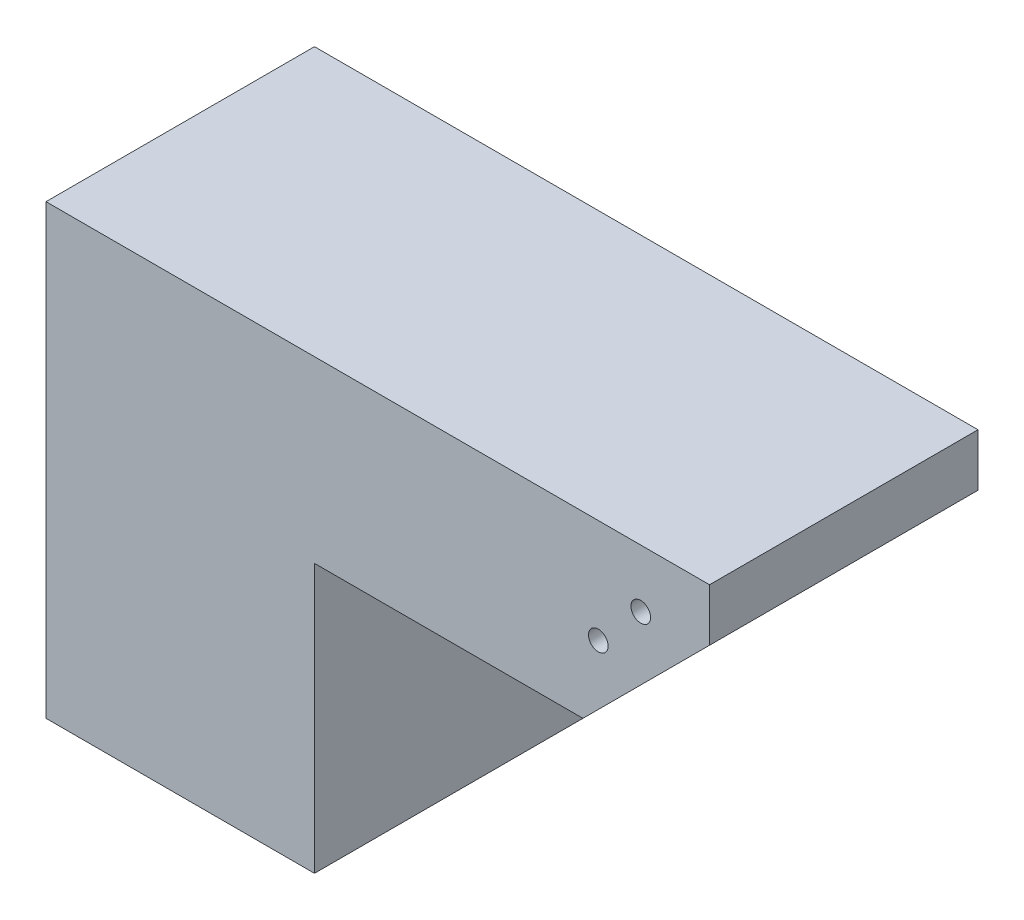
ISO-10303-21;
HEADER;
FILE_DESCRIPTION(('STEP AP214'),'2;1');
FILE_NAME('part.step','',(''),(''),'','','');
FILE_SCHEMA(('AUTOMOTIVE_DESIGN { 1 0 10303 214 1 1 1 1 }'));
ENDSEC;
DATA;
#1=APPLICATION_CONTEXT('core data for automotive mechanical design processes');
#2=APPLICATION_PROTOCOL_DEFINITION('international standard','automotive_design',2000,#1);
#3=PRODUCT_CONTEXT('',#1,'mechanical');
#4=PRODUCT('Part','Part','',(#3));
#5=PRODUCT_RELATED_PRODUCT_CATEGORY('part','',(#4));
#6=PRODUCT_DEFINITION_FORMATION('','',#4);
#7=PRODUCT_DEFINITION_CONTEXT('part definition',#1,'design');
#8=PRODUCT_DEFINITION('design','',#6,#7);
#9=PRODUCT_DEFINITION_SHAPE('','',#8);
#10=(LENGTH_UNIT() NAMED_UNIT(*) SI_UNIT(.MILLI.,.METRE.));
#11=(NAMED_UNIT(*) PLANE_ANGLE_UNIT() SI_UNIT($,.RADIAN.));
#12=(NAMED_UNIT(*) SI_UNIT($,.STERADIAN.) SOLID_ANGLE_UNIT());
#13=UNCERTAINTY_MEASURE_WITH_UNIT(LENGTH_MEASURE(1.E-05),#10,'distance_accuracy_value','');
#14=(GEOMETRIC_REPRESENTATION_CONTEXT(3) GLOBAL_UNCERTAINTY_ASSIGNED_CONTEXT((#13)) GLOBAL_UNIT_ASSIGNED_CONTEXT((#10,
#11,#12)) REPRESENTATION_CONTEXT('',''));
#15=CARTESIAN_POINT('',(0.,0.,0.));
#16=DIRECTION('',(0.,0.,1.));
#17=DIRECTION('',(1.,0.,0.));
#18=AXIS2_PLACEMENT_3D('',#15,#16,#17);
#19=CARTESIAN_POINT('',(0.,0.,15.));
#20=DIRECTION('',(0.,1.,0.));
#21=DIRECTION('',(0.,0.,1.));
#22=AXIS2_PLACEMENT_3D('',#19,#20,#21);
#23=PLANE('',#22);
#24=DIRECTION('',(-1.,0.,0.));
#25=VECTOR('',#24,1.);
#26=CARTESIAN_POINT('',(-11.85,0.,11.85));
#27=LINE('',#26,#25);
#28=CARTESIAN_POINT('',(11.85,0.,11.85));
#29=VERTEX_POINT('',#28);
#30=CARTESIAN_POINT('',(-11.85,0.,11.85));
#31=VERTEX_POINT('',#30);
#32=EDGE_CURVE('E205',#29,#31,#27,.T.);
#33=ORIENTED_EDGE('',*,*,#32,.F.);
#34=DIRECTION('',(0.,0.,1.));
#35=VECTOR('',#34,1.);
#36=CARTESIAN_POINT('',(11.85,0.,11.85));
#37=LINE('',#36,#35);
#38=CARTESIAN_POINT('',(11.85,0.,-11.85));
#39=VERTEX_POINT('',#38);
#40=EDGE_CURVE('E65',#39,#29,#37,.T.);
#41=ORIENTED_EDGE('',*,*,#40,.F.);
#42=DIRECTION('',(1.,0.,0.));
#43=VECTOR('',#42,1.);
#44=CARTESIAN_POINT('',(-11.85,0.,-11.85));
#45=LINE('',#44,#43);
#46=CARTESIAN_POINT('',(-11.85,0.,-11.85));
#47=VERTEX_POINT('',#46);
#48=EDGE_CURVE('E194',#47,#39,#45,.T.);
#49=ORIENTED_EDGE('',*,*,#48,.F.);
#50=DIRECTION('',(0.,0.,-1.));
#51=VECTOR('',#50,1.);
#52=CARTESIAN_POINT('',(-11.85,0.,11.85));
#53=LINE('',#52,#51);
#54=EDGE_CURVE('E208',#31,#47,#53,.T.);
#55=ORIENTED_EDGE('',*,*,#54,.F.);
#56=EDGE_LOOP('',(#33,#41,#49,#55));
#57=FACE_BOUND('',#56,.T.);
#58=DIRECTION('',(1.,0.,0.));
#59=VECTOR('',#58,1.);
#60=CARTESIAN_POINT('',(0.,0.,-15.));
#61=LINE('',#60,#59);
#62=CARTESIAN_POINT('',(-15.,0.,-15.));
#63=VERTEX_POINT('',#62);
#64=CARTESIAN_POINT('',(15.,0.,-15.));
#65=VERTEX_POINT('',#64);
#66=EDGE_CURVE('E215',#63,#65,#61,.T.);
#67=ORIENTED_EDGE('',*,*,#66,.T.);
#68=DIRECTION('',(0.,0.,-1.));
#69=VECTOR('',#68,1.);
#70=CARTESIAN_POINT('',(15.,0.,15.));
#71=LINE('',#70,#69);
#72=CARTESIAN_POINT('',(15.,0.,15.));
#73=VERTEX_POINT('',#72);
#74=EDGE_CURVE('E11',#73,#65,#71,.T.);
#75=ORIENTED_EDGE('',*,*,#74,.F.);
#76=DIRECTION('',(1.,0.,0.));
#77=VECTOR('',#76,1.);
#78=CARTESIAN_POINT('',(-15.,0.,15.));
#79=LINE('',#78,#77);
#80=CARTESIAN_POINT('',(-15.,0.,15.));
#81=VERTEX_POINT('',#80);
#82=EDGE_CURVE('E221',#81,#73,#79,.T.);
#83=ORIENTED_EDGE('',*,*,#82,.F.);
#84=DIRECTION('',(0.,0.,-1.));
#85=VECTOR('',#84,1.);
#86=CARTESIAN_POINT('',(-15.,0.,15.));
#87=LINE('',#86,#85);
#88=EDGE_CURVE('E236',#81,#63,#87,.T.);
#89=ORIENTED_EDGE('',*,*,#88,.T.);
#90=EDGE_LOOP('',(#67,#75,#83,#89));
#91=FACE_BOUND('',#90,.T.);
#92=ADVANCED_FACE('F41',(#57,#91),#23,.F.);
#93=CARTESIAN_POINT('',(15.,0.,15.));
#94=DIRECTION('',(-1.,0.,0.));
#95=DIRECTION('',(0.,0.,1.));
#96=AXIS2_PLACEMENT_3D('',#93,#94,#95);
#97=PLANE('',#96);
#98=DIRECTION('',(0.,1.,0.));
#99=VECTOR('',#98,1.);
#100=CARTESIAN_POINT('',(15.,0.,-15.));
#101=LINE('',#100,#99);
#102=CARTESIAN_POINT('',(15.,30.,-15.));
#103=VERTEX_POINT('',#102);
#104=EDGE_CURVE('E238',#65,#103,#101,.T.);
#105=ORIENTED_EDGE('',*,*,#104,.T.);
#106=DIRECTION('',(0.,0.,-1.));
#107=VECTOR('',#106,1.);
#108=CARTESIAN_POINT('',(15.,30.,15.));
#109=LINE('',#108,#107);
#110=CARTESIAN_POINT('',(15.,30.,15.));
#111=VERTEX_POINT('',#110);
#112=EDGE_CURVE('E49',#111,#103,#109,.T.);
#113=ORIENTED_EDGE('',*,*,#112,.F.);
#114=DIRECTION('',(0.,1.,0.));
#115=VECTOR('',#114,1.);
#116=CARTESIAN_POINT('',(15.,0.,15.));
#117=LINE('',#116,#115);
#118=EDGE_CURVE('E223',#73,#111,#117,.T.);
#119=ORIENTED_EDGE('',*,*,#118,.F.);
#120=ORIENTED_EDGE('',*,*,#74,.T.);
#121=EDGE_LOOP('',(#105,#113,#119,#120));
#122=FACE_BOUND('',#121,.T.);
#123=ADVANCED_FACE('F309',(#122),#97,.F.);
#124=CARTESIAN_POINT('',(15.,30.,15.));
#125=DIRECTION('',(0.,1.,0.));
#126=DIRECTION('',(0.,0.,1.));
#127=AXIS2_PLACEMENT_3D('',#124,#125,#126);
#128=PLANE('',#127);
#129=DIRECTION('',(1.,0.,0.));
#130=VECTOR('',#129,1.);
#131=CARTESIAN_POINT('',(15.,30.,-15.));
#132=LINE('',#131,#130);
#133=CARTESIAN_POINT('',(45.,30.,-15.));
#134=VERTEX_POINT('',#133);
#135=EDGE_CURVE('E240',#103,#134,#132,.T.);
#136=ORIENTED_EDGE('',*,*,#135,.T.);
#137=DIRECTION('',(0.,0.,-1.));
#138=VECTOR('',#137,1.);
#139=CARTESIAN_POINT('',(45.,30.,15.));
#140=LINE('',#139,#138);
#141=CARTESIAN_POINT('',(45.,30.,15.));
#142=VERTEX_POINT('',#141);
#143=EDGE_CURVE('E261',#142,#134,#140,.T.);
#144=ORIENTED_EDGE('',*,*,#143,.F.);
#145=DIRECTION('',(1.,0.,0.));
#146=VECTOR('',#145,1.);
#147=CARTESIAN_POINT('',(15.,30.,15.));
#148=LINE('',#147,#146);
#149=EDGE_CURVE('E226',#111,#142,#148,.T.);
#150=ORIENTED_EDGE('',*,*,#149,.F.);
#151=ORIENTED_EDGE('',*,*,#112,.T.);
#152=EDGE_LOOP('',(#136,#144,#150,#151));
#153=FACE_BOUND('',#152,.T.);
#154=ADVANCED_FACE('F316',(#153),#128,.F.);
#155=CARTESIAN_POINT('',(45.,30.,15.));
#156=DIRECTION('',(-0.707106781186549,0.707106781186546,0.));
#157=DIRECTION('',(-0.707106781186546,-0.707106781186549,0.));
#158=AXIS2_PLACEMENT_3D('',#155,#156,#157);
#159=PLANE('',#158);
#160=DIRECTION('',(0.,0.,1.));
#161=VECTOR('',#160,1.);
#162=CARTESIAN_POINT('',(56.3844191771034,41.3844191771034,6.10000000000001));
#163=LINE('',#162,#161);
#164=CARTESIAN_POINT('',(56.3844191771034,41.3844191771034,-6.09999999999999));
#165=VERTEX_POINT('',#164);
#166=CARTESIAN_POINT('',(56.3844191771034,41.3844191771034,6.10000000000001));
#167=VERTEX_POINT('',#166);
#168=EDGE_CURVE('E181',#165,#167,#163,.T.);
#169=ORIENTED_EDGE('',*,*,#168,.F.);
#170=DIRECTION('',(0.707106781186546,0.707106781186549,0.));
#171=VECTOR('',#170,1.);
#172=CARTESIAN_POINT('',(56.3844191771034,41.3844191771034,-6.09999999999999));
#173=LINE('',#172,#171);
#174=CARTESIAN_POINT('',(47.7577164466275,32.7577164466275,-6.09999999999999));
#175=VERTEX_POINT('',#174);
#176=EDGE_CURVE('E57',#175,#165,#173,.T.);
#177=ORIENTED_EDGE('',*,*,#176,.F.);
#178=DIRECTION('',(0.,0.,-1.));
#179=VECTOR('',#178,1.);
#180=CARTESIAN_POINT('',(47.7577164466275,32.7577164466275,6.10000000000001));
#181=LINE('',#180,#179);
#182=CARTESIAN_POINT('',(47.7577164466275,32.7577164466275,6.10000000000001));
#183=VERTEX_POINT('',#182);
#184=EDGE_CURVE('E169',#183,#175,#181,.T.);
#185=ORIENTED_EDGE('',*,*,#184,.F.);
#186=DIRECTION('',(-0.707106781186546,-0.707106781186549,0.));
#187=VECTOR('',#186,1.);
#188=CARTESIAN_POINT('',(56.3844191771034,41.3844191771034,6.10000000000001));
#189=LINE('',#188,#187);
#190=EDGE_CURVE('E172',#167,#183,#189,.T.);
#191=ORIENTED_EDGE('',*,*,#190,.F.);
#192=EDGE_LOOP('',(#169,#177,#185,#191));
#193=FACE_BOUND('',#192,.T.);
#194=DIRECTION('',(0.707106781186546,0.707106781186549,0.));
#195=VECTOR('',#194,1.);
#196=CARTESIAN_POINT('',(45.,30.,-15.));
#197=LINE('',#196,#195);
#198=CARTESIAN_POINT('',(59.1421356237309,44.142135623731,-15.));
#199=VERTEX_POINT('',#198);
#200=EDGE_CURVE('E242',#134,#199,#197,.T.);
#201=ORIENTED_EDGE('',*,*,#200,.T.);
#202=DIRECTION('',(0.,0.,-1.));
#203=VECTOR('',#202,1.);
#204=CARTESIAN_POINT('',(59.1421356237309,44.142135623731,15.));
#205=LINE('',#204,#203);
#206=CARTESIAN_POINT('',(59.1421356237309,44.142135623731,15.));
#207=VERTEX_POINT('',#206);
#208=EDGE_CURVE('E258',#207,#199,#205,.T.);
#209=ORIENTED_EDGE('',*,*,#208,.F.);
#210=DIRECTION('',(0.707106781186546,0.707106781186549,0.));
#211=VECTOR('',#210,1.);
#212=CARTESIAN_POINT('',(45.,30.,15.));
#213=LINE('',#212,#211);
#214=EDGE_CURVE('E228',#142,#207,#213,.T.);
#215=ORIENTED_EDGE('',*,*,#214,.F.);
#216=ORIENTED_EDGE('',*,*,#143,.T.);
#217=EDGE_LOOP('',(#201,#209,#215,#216));
#218=FACE_BOUND('',#217,.T.);
#219=ADVANCED_FACE('F338',(#193,#218),#159,.F.);
#220=CARTESIAN_POINT('',(59.1421356237309,44.142135623731,15.));
#221=DIRECTION('',(-1.,0.,0.));
#222=DIRECTION('',(0.,-1.,0.));
#223=AXIS2_PLACEMENT_3D('',#220,#221,#222);
#224=PLANE('',#223);
#225=DIRECTION('',(0.,1.,0.));
#226=VECTOR('',#225,1.);
#227=CARTESIAN_POINT('',(59.1421356237309,44.142135623731,-15.));
#228=LINE('',#227,#226);
#229=CARTESIAN_POINT('',(59.1421356237309,50.,-15.));
#230=VERTEX_POINT('',#229);
#231=EDGE_CURVE('E244',#199,#230,#228,.T.);
#232=ORIENTED_EDGE('',*,*,#231,.T.);
#233=DIRECTION('',(0.,0.,-1.));
#234=VECTOR('',#233,1.);
#235=CARTESIAN_POINT('',(59.1421356237309,50.,15.));
#236=LINE('',#235,#234);
#237=CARTESIAN_POINT('',(59.1421356237309,50.,15.));
#238=VERTEX_POINT('',#237);
#239=EDGE_CURVE('E255',#238,#230,#236,.T.);
#240=ORIENTED_EDGE('',*,*,#239,.F.);
#241=DIRECTION('',(0.,1.,0.));
#242=VECTOR('',#241,1.);
#243=CARTESIAN_POINT('',(59.1421356237309,44.142135623731,15.));
#244=LINE('',#243,#242);
#245=EDGE_CURVE('E230',#207,#238,#244,.T.);
#246=ORIENTED_EDGE('',*,*,#245,.F.);
#247=ORIENTED_EDGE('',*,*,#208,.T.);
#248=EDGE_LOOP('',(#232,#240,#246,#247));
#249=FACE_BOUND('',#248,.T.);
#250=ADVANCED_FACE('F353',(#249),#224,.F.);
#251=CARTESIAN_POINT('',(59.1421356237309,50.,15.));
#252=DIRECTION('',(0.,-1.,0.));
#253=DIRECTION('',(1.,0.,0.));
#254=AXIS2_PLACEMENT_3D('',#251,#252,#253);
#255=PLANE('',#254);
#256=DIRECTION('',(-1.,0.,0.));
#257=VECTOR('',#256,1.);
#258=CARTESIAN_POINT('',(59.1421356237309,50.,-15.));
#259=LINE('',#258,#257);
#260=CARTESIAN_POINT('',(-15.,50.,-15.));
#261=VERTEX_POINT('',#260);
#262=EDGE_CURVE('E246',#230,#261,#259,.T.);
#263=ORIENTED_EDGE('',*,*,#262,.T.);
#264=DIRECTION('',(0.,0.,-1.));
#265=VECTOR('',#264,1.);
#266=CARTESIAN_POINT('',(-15.,50.,15.));
#267=LINE('',#266,#265);
#268=CARTESIAN_POINT('',(-15.,50.,15.));
#269=VERTEX_POINT('',#268);
#270=EDGE_CURVE('E252',#269,#261,#267,.T.);
#271=ORIENTED_EDGE('',*,*,#270,.F.);
#272=DIRECTION('',(-1.,0.,0.));
#273=VECTOR('',#272,1.);
#274=CARTESIAN_POINT('',(59.1421356237309,50.,15.));
#275=LINE('',#274,#273);
#276=EDGE_CURVE('E232',#238,#269,#275,.T.);
#277=ORIENTED_EDGE('',*,*,#276,.F.);
#278=ORIENTED_EDGE('',*,*,#239,.T.);
#279=EDGE_LOOP('',(#263,#271,#277,#278));
#280=FACE_BOUND('',#279,.T.);
#281=ADVANCED_FACE('F351',(#280),#255,.F.);
#282=CARTESIAN_POINT('',(-15.,50.,15.));
#283=DIRECTION('',(1.,0.,0.));
#284=DIRECTION('',(0.,1.,0.));
#285=AXIS2_PLACEMENT_3D('',#282,#283,#284);
#286=PLANE('',#285);
#287=DIRECTION('',(0.,-1.,0.));
#288=VECTOR('',#287,1.);
#289=CARTESIAN_POINT('',(-15.,50.,-15.));
#290=LINE('',#289,#288);
#291=EDGE_CURVE('E224',#261,#63,#290,.T.);
#292=ORIENTED_EDGE('',*,*,#291,.T.);
#293=ORIENTED_EDGE('',*,*,#88,.F.);
#294=DIRECTION('',(0.,-1.,0.));
#295=VECTOR('',#294,1.);
#296=CARTESIAN_POINT('',(-15.,50.,15.));
#297=LINE('',#296,#295);
#298=EDGE_CURVE('E234',#269,#81,#297,.T.);
#299=ORIENTED_EDGE('',*,*,#298,.F.);
#300=ORIENTED_EDGE('',*,*,#270,.T.);
#301=EDGE_LOOP('',(#292,#293,#299,#300));
#302=FACE_BOUND('',#301,.T.);
#303=ADVANCED_FACE('F348',(#302),#286,.F.);
#304=CARTESIAN_POINT('',(0.,0.,15.));
#305=DIRECTION('',(0.,0.,1.));
#306=DIRECTION('',(1.,0.,0.));
#307=AXIS2_PLACEMENT_3D('',#304,#305,#306);
#308=PLANE('',#307);
#309=CARTESIAN_POINT('',(46.7143735668413,38.394222142678,15.));
#310=DIRECTION('',(0.,0.,1.));
#311=DIRECTION('',(1.,0.,0.));
#312=AXIS2_PLACEMENT_3D('',#309,#310,#311);
#313=CIRCLE('',#312,1.1);
#314=CARTESIAN_POINT('',(47.8143735668413,38.394222142678,15.));
#315=VERTEX_POINT('',#314);
#316=EDGE_CURVE('E281',#315,#315,#313,.T.);
#317=ORIENTED_EDGE('',*,*,#316,.F.);
#318=EDGE_LOOP('',(#317));
#319=FACE_BOUND('',#318,.T.);
#320=CARTESIAN_POINT('',(51.46,43.54,15.));
#321=DIRECTION('',(0.,0.,1.));
#322=DIRECTION('',(1.,0.,0.));
#323=AXIS2_PLACEMENT_3D('',#320,#321,#322);
#324=CIRCLE('',#323,1.10000000000001);
#325=CARTESIAN_POINT('',(52.56,43.54,15.));
#326=VERTEX_POINT('',#325);
#327=EDGE_CURVE('E272',#326,#326,#324,.T.);
#328=ORIENTED_EDGE('',*,*,#327,.F.);
#329=EDGE_LOOP('',(#328));
#330=FACE_BOUND('',#329,.T.);
#331=ORIENTED_EDGE('',*,*,#82,.T.);
#332=ORIENTED_EDGE('',*,*,#118,.T.);
#333=ORIENTED_EDGE('',*,*,#149,.T.);
#334=ORIENTED_EDGE('',*,*,#214,.T.);
#335=ORIENTED_EDGE('',*,*,#245,.T.);
#336=ORIENTED_EDGE('',*,*,#276,.T.);
#337=ORIENTED_EDGE('',*,*,#298,.T.);
#338=EDGE_LOOP('',(#331,#332,#333,#334,#335,#336,#337));
#339=FACE_BOUND('',#338,.T.);
#340=ADVANCED_FACE('F342',(#319,#330,#339),#308,.T.);
#341=CARTESIAN_POINT('',(0.,0.,-15.));
#342=DIRECTION('',(0.,0.,1.));
#343=DIRECTION('',(1.,0.,0.));
#344=AXIS2_PLACEMENT_3D('',#341,#342,#343);
#345=PLANE('',#344);
#346=CARTESIAN_POINT('',(46.7143735668413,38.394222142678,-15.));
#347=DIRECTION('',(0.,0.,1.));
#348=DIRECTION('',(1.,0.,0.));
#349=AXIS2_PLACEMENT_3D('',#346,#347,#348);
#350=CIRCLE('',#349,1.1);
#351=CARTESIAN_POINT('',(47.8143735668413,38.394222142678,-15.));
#352=VERTEX_POINT('',#351);
#353=EDGE_CURVE('E284',#352,#352,#350,.T.);
#354=ORIENTED_EDGE('',*,*,#353,.T.);
#355=EDGE_LOOP('',(#354));
#356=FACE_BOUND('',#355,.T.);
#357=CARTESIAN_POINT('',(51.46,43.54,-15.));
#358=DIRECTION('',(0.,0.,1.));
#359=DIRECTION('',(1.,0.,0.));
#360=AXIS2_PLACEMENT_3D('',#357,#358,#359);
#361=CIRCLE('',#360,1.10000000000001);
#362=CARTESIAN_POINT('',(52.56,43.54,-15.));
#363=VERTEX_POINT('',#362);
#364=EDGE_CURVE('E267',#363,#363,#361,.T.);
#365=ORIENTED_EDGE('',*,*,#364,.T.);
#366=EDGE_LOOP('',(#365));
#367=FACE_BOUND('',#366,.T.);
#368=ORIENTED_EDGE('',*,*,#66,.F.);
#369=ORIENTED_EDGE('',*,*,#291,.F.);
#370=ORIENTED_EDGE('',*,*,#262,.F.);
#371=ORIENTED_EDGE('',*,*,#231,.F.);
#372=ORIENTED_EDGE('',*,*,#200,.F.);
#373=ORIENTED_EDGE('',*,*,#135,.F.);
#374=ORIENTED_EDGE('',*,*,#104,.F.);
#375=EDGE_LOOP('',(#368,#369,#370,#371,#372,#373,#374));
#376=FACE_BOUND('',#375,.T.);
#377=ADVANCED_FACE('F330',(#356,#367,#376),#345,.F.);
#378=CARTESIAN_POINT('',(11.85,26.,11.85));
#379=DIRECTION('',(1.,0.,0.));
#380=DIRECTION('',(0.,0.,-1.));
#381=AXIS2_PLACEMENT_3D('',#378,#379,#380);
#382=PLANE('',#381);
#383=ORIENTED_EDGE('',*,*,#40,.T.);
#384=DIRECTION('',(0.,-1.,0.));
#385=VECTOR('',#384,1.);
#386=CARTESIAN_POINT('',(11.85,26.,11.85));
#387=LINE('',#386,#385);
#388=CARTESIAN_POINT('',(11.85,26.,11.85));
#389=VERTEX_POINT('',#388);
#390=EDGE_CURVE('E203',#389,#29,#387,.T.);
#391=ORIENTED_EDGE('',*,*,#390,.F.);
#392=DIRECTION('',(0.,0.,1.));
#393=VECTOR('',#392,1.);
#394=CARTESIAN_POINT('',(11.85,26.,11.85));
#395=LINE('',#394,#393);
#396=CARTESIAN_POINT('',(11.85,26.,-11.85));
#397=VERTEX_POINT('',#396);
#398=EDGE_CURVE('E190',#397,#389,#395,.T.);
#399=ORIENTED_EDGE('',*,*,#398,.F.);
#400=DIRECTION('',(0.,-1.,0.));
#401=VECTOR('',#400,1.);
#402=CARTESIAN_POINT('',(11.85,26.,-11.85));
#403=LINE('',#402,#401);
#404=EDGE_CURVE('E213',#397,#39,#403,.T.);
#405=ORIENTED_EDGE('',*,*,#404,.T.);
#406=EDGE_LOOP('',(#383,#391,#399,#405));
#407=FACE_BOUND('',#406,.T.);
#408=ADVANCED_FACE('F417',(#407),#382,.F.);
#409=CARTESIAN_POINT('',(-11.85,26.,-11.85));
#410=DIRECTION('',(0.,0.,-1.));
#411=DIRECTION('',(-1.,0.,0.));
#412=AXIS2_PLACEMENT_3D('',#409,#410,#411);
#413=PLANE('',#412);
#414=ORIENTED_EDGE('',*,*,#48,.T.);
#415=ORIENTED_EDGE('',*,*,#404,.F.);
#416=DIRECTION('',(1.,0.,0.));
#417=VECTOR('',#416,1.);
#418=CARTESIAN_POINT('',(-11.85,26.,-11.85));
#419=LINE('',#418,#417);
#420=CARTESIAN_POINT('',(-11.85,26.,-11.85));
#421=VERTEX_POINT('',#420);
#422=EDGE_CURVE('E200',#421,#397,#419,.T.);
#423=ORIENTED_EDGE('',*,*,#422,.F.);
#424=DIRECTION('',(0.,-1.,0.));
#425=VECTOR('',#424,1.);
#426=CARTESIAN_POINT('',(-11.85,26.,-11.85));
#427=LINE('',#426,#425);
#428=EDGE_CURVE('E216',#421,#47,#427,.T.);
#429=ORIENTED_EDGE('',*,*,#428,.T.);
#430=EDGE_LOOP('',(#414,#415,#423,#429));
#431=FACE_BOUND('',#430,.T.);
#432=ADVANCED_FACE('F424',(#431),#413,.F.);
#433=CARTESIAN_POINT('',(-11.85,26.,11.85));
#434=DIRECTION('',(-1.,0.,0.));
#435=DIRECTION('',(0.,0.,1.));
#436=AXIS2_PLACEMENT_3D('',#433,#434,#435);
#437=PLANE('',#436);
#438=ORIENTED_EDGE('',*,*,#54,.T.);
#439=ORIENTED_EDGE('',*,*,#428,.F.);
#440=DIRECTION('',(0.,0.,-1.));
#441=VECTOR('',#440,1.);
#442=CARTESIAN_POINT('',(-11.85,26.,11.85));
#443=LINE('',#442,#441);
#444=CARTESIAN_POINT('',(-11.85,26.,11.85));
#445=VERTEX_POINT('',#444);
#446=EDGE_CURVE('E197',#445,#421,#443,.T.);
#447=ORIENTED_EDGE('',*,*,#446,.F.);
#448=DIRECTION('',(0.,-1.,0.));
#449=VECTOR('',#448,1.);
#450=CARTESIAN_POINT('',(-11.85,26.,11.85));
#451=LINE('',#450,#449);
#452=EDGE_CURVE('E218',#445,#31,#451,.T.);
#453=ORIENTED_EDGE('',*,*,#452,.T.);
#454=EDGE_LOOP('',(#438,#439,#447,#453));
#455=FACE_BOUND('',#454,.T.);
#456=ADVANCED_FACE('F432',(#455),#437,.F.);
#457=CARTESIAN_POINT('',(-11.85,26.,11.85));
#458=DIRECTION('',(0.,0.,1.));
#459=DIRECTION('',(1.,0.,0.));
#460=AXIS2_PLACEMENT_3D('',#457,#458,#459);
#461=PLANE('',#460);
#462=ORIENTED_EDGE('',*,*,#32,.T.);
#463=ORIENTED_EDGE('',*,*,#452,.F.);
#464=DIRECTION('',(-1.,0.,0.));
#465=VECTOR('',#464,1.);
#466=CARTESIAN_POINT('',(-11.85,26.,11.85));
#467=LINE('',#466,#465);
#468=EDGE_CURVE('E193',#389,#445,#467,.T.);
#469=ORIENTED_EDGE('',*,*,#468,.F.);
#470=ORIENTED_EDGE('',*,*,#390,.T.);
#471=EDGE_LOOP('',(#462,#463,#469,#470));
#472=FACE_BOUND('',#471,.T.);
#473=ADVANCED_FACE('F441',(#472),#461,.F.);
#474=CARTESIAN_POINT('',(0.,26.,0.));
#475=DIRECTION('',(0.,-1.,0.));
#476=DIRECTION('',(0.,0.,-1.));
#477=AXIS2_PLACEMENT_3D('',#474,#475,#476);
#478=PLANE('',#477);
#479=ORIENTED_EDGE('',*,*,#398,.T.);
#480=ORIENTED_EDGE('',*,*,#468,.T.);
#481=ORIENTED_EDGE('',*,*,#446,.T.);
#482=ORIENTED_EDGE('',*,*,#422,.T.);
#483=EDGE_LOOP('',(#479,#480,#481,#482));
#484=FACE_BOUND('',#483,.T.);
#485=ADVANCED_FACE('F450',(#484),#478,.T.);
#486=CARTESIAN_POINT('',(49.0305086527633,48.7383297014435,-6.09999999999999));
#487=DIRECTION('',(0.,0.,-1.));
#488=DIRECTION('',(0.,1.,0.));
#489=AXIS2_PLACEMENT_3D('',#486,#487,#488);
#490=PLANE('',#489);
#491=CARTESIAN_POINT('',(46.7143735668413,38.394222142678,-6.09999999999999));
#492=DIRECTION('',(0.,0.,-1.));
#493=DIRECTION('',(0.,1.,0.));
#494=AXIS2_PLACEMENT_3D('',#491,#492,#493);
#495=CIRCLE('',#494,1.1);
#496=CARTESIAN_POINT('',(46.7143735668413,39.494222142678,-6.09999999999999));
#497=VERTEX_POINT('',#496);
#498=EDGE_CURVE('E277',#497,#497,#495,.T.);
#499=ORIENTED_EDGE('',*,*,#498,.T.);
#500=EDGE_LOOP('',(#499));
#501=FACE_BOUND('',#500,.T.);
#502=CARTESIAN_POINT('',(51.46,43.54,-6.09999999999999));
#503=DIRECTION('',(0.,0.,-1.));
#504=DIRECTION('',(0.,1.,0.));
#505=AXIS2_PLACEMENT_3D('',#502,#503,#504);
#506=CIRCLE('',#505,1.10000000000001);
#507=CARTESIAN_POINT('',(51.46,44.64,-6.09999999999999));
#508=VERTEX_POINT('',#507);
#509=EDGE_CURVE('E175',#508,#508,#506,.T.);
#510=ORIENTED_EDGE('',*,*,#509,.T.);
#511=EDGE_LOOP('',(#510));
#512=FACE_BOUND('',#511,.T.);
#513=ORIENTED_EDGE('',*,*,#176,.T.);
#514=DIRECTION('',(0.707106781186549,-0.707106781186546,0.));
#515=VECTOR('',#514,1.);
#516=CARTESIAN_POINT('',(49.0305086527633,48.7383297014435,-6.09999999999999));
#517=LINE('',#516,#515);
#518=CARTESIAN_POINT('',(49.0305086527633,48.7383297014435,-6.09999999999999));
#519=VERTEX_POINT('',#518);
#520=EDGE_CURVE('E147',#519,#165,#517,.T.);
#521=ORIENTED_EDGE('',*,*,#520,.F.);
#522=DIRECTION('',(0.707106781186546,0.707106781186549,0.));
#523=VECTOR('',#522,1.);
#524=CARTESIAN_POINT('',(49.0305086527633,48.7383297014435,-6.09999999999999));
#525=LINE('',#524,#523);
#526=CARTESIAN_POINT('',(40.4038059222874,40.1116269709676,-6.09999999999999));
#527=VERTEX_POINT('',#526);
#528=EDGE_CURVE('E151',#527,#519,#525,.T.);
#529=ORIENTED_EDGE('',*,*,#528,.F.);
#530=DIRECTION('',(0.707106781186549,-0.707106781186546,0.));
#531=VECTOR('',#530,1.);
#532=CARTESIAN_POINT('',(40.4038059222874,40.1116269709676,-6.09999999999999));
#533=LINE('',#532,#531);
#534=EDGE_CURVE('E185',#527,#175,#533,.T.);
#535=ORIENTED_EDGE('',*,*,#534,.T.);
#536=EDGE_LOOP('',(#513,#521,#529,#535));
#537=FACE_BOUND('',#536,.T.);
#538=ADVANCED_FACE('F149',(#501,#512,#537),#490,.F.);
#539=CARTESIAN_POINT('',(40.4038059222874,40.1116269709676,6.10000000000001));
#540=DIRECTION('',(-0.707106781186546,-0.707106781186549,0.));
#541=DIRECTION('',(0.707106781186549,-0.707106781186546,0.));
#542=AXIS2_PLACEMENT_3D('',#539,#540,#541);
#543=PLANE('',#542);
#544=ORIENTED_EDGE('',*,*,#184,.T.);
#545=ORIENTED_EDGE('',*,*,#534,.F.);
#546=DIRECTION('',(0.,0.,-1.));
#547=VECTOR('',#546,1.);
#548=CARTESIAN_POINT('',(40.4038059222874,40.1116269709676,6.10000000000001));
#549=LINE('',#548,#547);
#550=CARTESIAN_POINT('',(40.4038059222874,40.1116269709676,6.10000000000001));
#551=VERTEX_POINT('',#550);
#552=EDGE_CURVE('E157',#551,#527,#549,.T.);
#553=ORIENTED_EDGE('',*,*,#552,.F.);
#554=DIRECTION('',(0.707106781186549,-0.707106781186546,0.));
#555=VECTOR('',#554,1.);
#556=CARTESIAN_POINT('',(40.4038059222874,40.1116269709676,6.10000000000001));
#557=LINE('',#556,#555);
#558=EDGE_CURVE('E187',#551,#183,#557,.T.);
#559=ORIENTED_EDGE('',*,*,#558,.T.);
#560=EDGE_LOOP('',(#544,#545,#553,#559));
#561=FACE_BOUND('',#560,.T.);
#562=ADVANCED_FACE('F467',(#561),#543,.F.);
#563=CARTESIAN_POINT('',(49.0305086527633,48.7383297014435,6.10000000000001));
#564=DIRECTION('',(0.,0.,1.));
#565=DIRECTION('',(0.,-1.,0.));
#566=AXIS2_PLACEMENT_3D('',#563,#564,#565);
#567=PLANE('',#566);
#568=CARTESIAN_POINT('',(46.7143735668413,38.394222142678,6.10000000000001));
#569=DIRECTION('',(0.,0.,1.));
#570=DIRECTION('',(0.,-1.,0.));
#571=AXIS2_PLACEMENT_3D('',#568,#569,#570);
#572=CIRCLE('',#571,1.1);
#573=CARTESIAN_POINT('',(46.7143735668413,37.294222142678,6.10000000000001));
#574=VERTEX_POINT('',#573);
#575=EDGE_CURVE('E44',#574,#574,#572,.T.);
#576=ORIENTED_EDGE('',*,*,#575,.T.);
#577=EDGE_LOOP('',(#576));
#578=FACE_BOUND('',#577,.T.);
#579=CARTESIAN_POINT('',(51.46,43.54,6.10000000000001));
#580=DIRECTION('',(0.,0.,1.));
#581=DIRECTION('',(0.,-1.,0.));
#582=AXIS2_PLACEMENT_3D('',#579,#580,#581);
#583=CIRCLE('',#582,1.10000000000001);
#584=CARTESIAN_POINT('',(51.46,42.44,6.10000000000001));
#585=VERTEX_POINT('',#584);
#586=EDGE_CURVE('E265',#585,#585,#583,.T.);
#587=ORIENTED_EDGE('',*,*,#586,.T.);
#588=EDGE_LOOP('',(#587));
#589=FACE_BOUND('',#588,.T.);
#590=ORIENTED_EDGE('',*,*,#190,.T.);
#591=ORIENTED_EDGE('',*,*,#558,.F.);
#592=DIRECTION('',(-0.707106781186546,-0.707106781186549,0.));
#593=VECTOR('',#592,1.);
#594=CARTESIAN_POINT('',(49.0305086527633,48.7383297014435,6.10000000000001));
#595=LINE('',#594,#593);
#596=CARTESIAN_POINT('',(49.0305086527633,48.7383297014435,6.10000000000001));
#597=VERTEX_POINT('',#596);
#598=EDGE_CURVE('E165',#597,#551,#595,.T.);
#599=ORIENTED_EDGE('',*,*,#598,.F.);
#600=DIRECTION('',(0.707106781186549,-0.707106781186546,0.));
#601=VECTOR('',#600,1.);
#602=CARTESIAN_POINT('',(49.0305086527633,48.7383297014435,6.10000000000001));
#603=LINE('',#602,#601);
#604=EDGE_CURVE('E156',#597,#167,#603,.T.);
#605=ORIENTED_EDGE('',*,*,#604,.T.);
#606=EDGE_LOOP('',(#590,#591,#599,#605));
#607=FACE_BOUND('',#606,.T.);
#608=ADVANCED_FACE('F291',(#578,#589,#607),#567,.F.);
#609=CARTESIAN_POINT('',(49.0305086527633,48.7383297014435,6.10000000000001));
#610=DIRECTION('',(0.707106781186546,0.707106781186549,0.));
#611=DIRECTION('',(-0.707106781186549,0.707106781186546,0.));
#612=AXIS2_PLACEMENT_3D('',#609,#610,#611);
#613=PLANE('',#612);
#614=ORIENTED_EDGE('',*,*,#168,.T.);
#615=ORIENTED_EDGE('',*,*,#604,.F.);
#616=DIRECTION('',(0.,0.,1.));
#617=VECTOR('',#616,1.);
#618=CARTESIAN_POINT('',(49.0305086527633,48.7383297014435,6.10000000000001));
#619=LINE('',#618,#617);
#620=EDGE_CURVE('E160',#519,#597,#619,.T.);
#621=ORIENTED_EDGE('',*,*,#620,.F.);
#622=ORIENTED_EDGE('',*,*,#520,.T.);
#623=EDGE_LOOP('',(#614,#615,#621,#622));
#624=FACE_BOUND('',#623,.T.);
#625=ADVANCED_FACE('F161',(#624),#613,.F.);
#626=CARTESIAN_POINT('',(0.146089475659973,-0.146089475659973,0.));
#627=DIRECTION('',(0.707106781186549,-0.707106781186546,0.));
#628=DIRECTION('',(0.707106781186546,0.707106781186549,0.));
#629=AXIS2_PLACEMENT_3D('',#626,#627,#628);
#630=PLANE('',#629);
#631=ORIENTED_EDGE('',*,*,#528,.T.);
#632=ORIENTED_EDGE('',*,*,#620,.T.);
#633=ORIENTED_EDGE('',*,*,#598,.T.);
#634=ORIENTED_EDGE('',*,*,#552,.T.);
#635=EDGE_LOOP('',(#631,#632,#633,#634));
#636=FACE_BOUND('',#635,.T.);
#637=ADVANCED_FACE('F167',(#636),#630,.T.);
#638=CARTESIAN_POINT('',(51.46,43.54,-15.));
#639=DIRECTION('',(0.,0.,1.));
#640=DIRECTION('',(1.,0.,0.));
#641=AXIS2_PLACEMENT_3D('',#638,#639,#640);
#642=CYLINDRICAL_SURFACE('',#641,1.10000000000001);
#643=ORIENTED_EDGE('',*,*,#327,.T.);
#644=EDGE_LOOP('',(#643));
#645=FACE_BOUND('',#644,.T.);
#646=ORIENTED_EDGE('',*,*,#586,.F.);
#647=EDGE_LOOP('',(#646));
#648=FACE_BOUND('',#647,.T.);
#649=ADVANCED_FACE('F305',(#645,#648),#642,.F.);
#650=ORIENTED_EDGE('',*,*,#364,.F.);
#651=EDGE_LOOP('',(#650));
#652=FACE_BOUND('',#651,.T.);
#653=ORIENTED_EDGE('',*,*,#509,.F.);
#654=EDGE_LOOP('',(#653));
#655=FACE_BOUND('',#654,.T.);
#656=ADVANCED_FACE('F296',(#652,#655),#642,.F.);
#657=CARTESIAN_POINT('',(46.7143735668413,38.394222142678,-15.));
#658=DIRECTION('',(0.,0.,1.));
#659=DIRECTION('',(1.,0.,0.));
#660=AXIS2_PLACEMENT_3D('',#657,#658,#659);
#661=CYLINDRICAL_SURFACE('',#660,1.1);
#662=ORIENTED_EDGE('',*,*,#316,.T.);
#663=EDGE_LOOP('',(#662));
#664=FACE_BOUND('',#663,.T.);
#665=ORIENTED_EDGE('',*,*,#575,.F.);
#666=EDGE_LOOP('',(#665));
#667=FACE_BOUND('',#666,.T.);
#668=ADVANCED_FACE('F293',(#664,#667),#661,.F.);
#669=ORIENTED_EDGE('',*,*,#353,.F.);
#670=EDGE_LOOP('',(#669));
#671=FACE_BOUND('',#670,.T.);
#672=ORIENTED_EDGE('',*,*,#498,.F.);
#673=EDGE_LOOP('',(#672));
#674=FACE_BOUND('',#673,.T.);
#675=ADVANCED_FACE('F295',(#671,#674),#661,.F.);
#676=CLOSED_SHELL('',(#92,#123,#154,#219,#250,#281,#303,#340,#377,#408,#432,#456,#473,#485,#538,
#562,#608,#625,#637,#649,#656,#668,#675));
#677=MANIFOLD_SOLID_BREP('B2',#676);
#678=ADVANCED_BREP_SHAPE_REPRESENTATION('',(#18,#677),#14);
#679=SHAPE_DEFINITION_REPRESENTATION(#9,#678);
ENDSEC;
END-ISO-10303-21;
